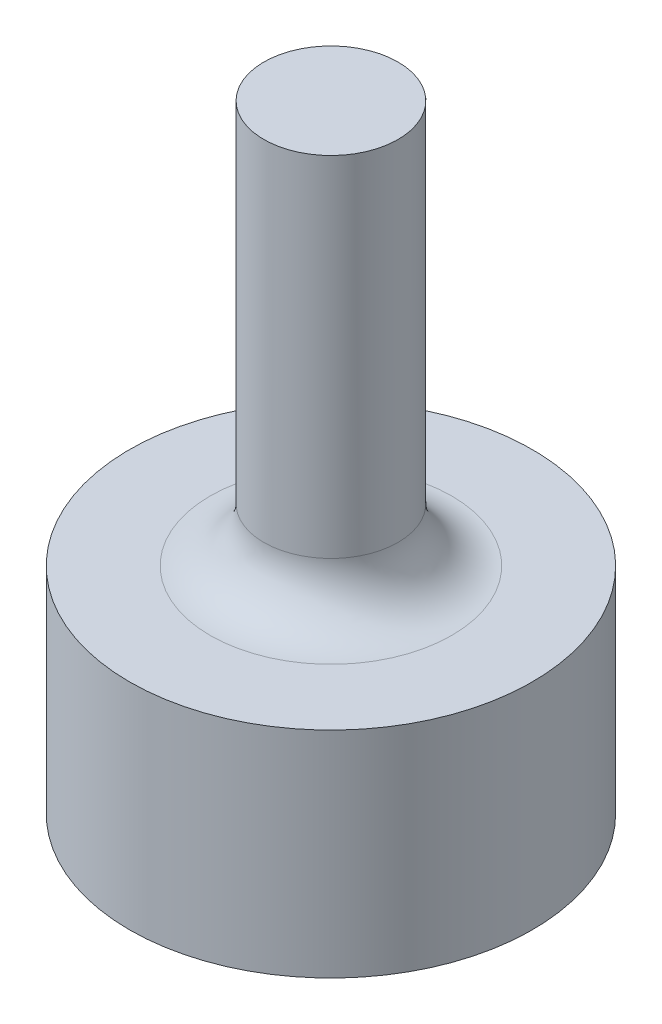
ISO-10303-21;
HEADER;
FILE_DESCRIPTION(('STEP AP214'),'2;1');
FILE_NAME('part.step','',(''),(''),'','','');
FILE_SCHEMA(('AUTOMOTIVE_DESIGN { 1 0 10303 214 1 1 1 1 }'));
ENDSEC;
DATA;
#1=APPLICATION_CONTEXT('core data for automotive mechanical design processes');
#2=APPLICATION_PROTOCOL_DEFINITION('international standard','automotive_design',2000,#1);
#3=PRODUCT_CONTEXT('',#1,'mechanical');
#4=PRODUCT('Part','Part','',(#3));
#5=PRODUCT_RELATED_PRODUCT_CATEGORY('part','',(#4));
#6=PRODUCT_DEFINITION_FORMATION('','',#4);
#7=PRODUCT_DEFINITION_CONTEXT('part definition',#1,'design');
#8=PRODUCT_DEFINITION('design','',#6,#7);
#9=PRODUCT_DEFINITION_SHAPE('','',#8);
#10=(LENGTH_UNIT() NAMED_UNIT(*) SI_UNIT(.MILLI.,.METRE.));
#11=(NAMED_UNIT(*) PLANE_ANGLE_UNIT() SI_UNIT($,.RADIAN.));
#12=(NAMED_UNIT(*) SI_UNIT($,.STERADIAN.) SOLID_ANGLE_UNIT());
#13=UNCERTAINTY_MEASURE_WITH_UNIT(LENGTH_MEASURE(1.E-05),#10,'distance_accuracy_value','');
#14=(GEOMETRIC_REPRESENTATION_CONTEXT(3) GLOBAL_UNCERTAINTY_ASSIGNED_CONTEXT((#13)) GLOBAL_UNIT_ASSIGNED_CONTEXT((#10,
#11,#12)) REPRESENTATION_CONTEXT('',''));
#15=CARTESIAN_POINT('',(0.,0.,0.));
#16=DIRECTION('',(0.,0.,1.));
#17=DIRECTION('',(1.,0.,0.));
#18=AXIS2_PLACEMENT_3D('',#15,#16,#17);
#19=CARTESIAN_POINT('',(0.,10.16,0.));
#20=DIRECTION('',(0.,-1.,0.));
#21=DIRECTION('',(0.,0.,-1.));
#22=AXIS2_PLACEMENT_3D('',#19,#20,#21);
#23=CYLINDRICAL_SURFACE('',#22,9.525);
#24=CARTESIAN_POINT('',(0.,10.16,0.));
#25=DIRECTION('',(0.,1.,0.));
#26=DIRECTION('',(0.,0.,1.));
#27=AXIS2_PLACEMENT_3D('',#24,#25,#26);
#28=CIRCLE('',#27,9.525);
#29=CARTESIAN_POINT('',(0.,10.16,9.525));
#30=VERTEX_POINT('',#29);
#31=EDGE_CURVE('E50',#30,#30,#28,.T.);
#32=ORIENTED_EDGE('',*,*,#31,.F.);
#33=EDGE_LOOP('',(#32));
#34=FACE_BOUND('',#33,.T.);
#35=CARTESIAN_POINT('',(0.,0.,0.));
#36=DIRECTION('',(0.,1.,0.));
#37=DIRECTION('',(0.,0.,1.));
#38=AXIS2_PLACEMENT_3D('',#35,#36,#37);
#39=CIRCLE('',#38,9.525);
#40=CARTESIAN_POINT('',(0.,0.,9.525));
#41=VERTEX_POINT('',#40);
#42=EDGE_CURVE('E55',#41,#41,#39,.T.);
#43=ORIENTED_EDGE('',*,*,#42,.T.);
#44=EDGE_LOOP('',(#43));
#45=FACE_BOUND('',#44,.T.);
#46=ADVANCED_FACE('F37',(#34,#45),#23,.T.);
#47=CARTESIAN_POINT('',(0.,10.16,0.));
#48=DIRECTION('',(0.,1.,0.));
#49=DIRECTION('',(0.,0.,1.));
#50=AXIS2_PLACEMENT_3D('',#47,#48,#49);
#51=PLANE('',#50);
#52=CARTESIAN_POINT('',(0.,10.16,0.));
#53=DIRECTION('',(0.,1.,0.));
#54=DIRECTION('',(0.,0.,1.));
#55=AXIS2_PLACEMENT_3D('',#52,#53,#54);
#56=CIRCLE('',#55,5.715);
#57=CARTESIAN_POINT('',(0.,10.16,5.715));
#58=VERTEX_POINT('',#57);
#59=EDGE_CURVE('E10',#58,#58,#56,.F.);
#60=ORIENTED_EDGE('',*,*,#59,.T.);
#61=EDGE_LOOP('',(#60));
#62=FACE_BOUND('',#61,.T.);
#63=ORIENTED_EDGE('',*,*,#31,.T.);
#64=EDGE_LOOP('',(#63));
#65=FACE_BOUND('',#64,.T.);
#66=ADVANCED_FACE('F89',(#62,#65),#51,.T.);
#67=CARTESIAN_POINT('',(0.,0.,0.));
#68=DIRECTION('',(0.,1.,0.));
#69=DIRECTION('',(0.,0.,1.));
#70=AXIS2_PLACEMENT_3D('',#67,#68,#69);
#71=PLANE('',#70);
#72=CARTESIAN_POINT('',(0.,0.,0.));
#73=DIRECTION('',(0.,-1.,0.));
#74=DIRECTION('',(0.,0.,-1.));
#75=AXIS2_PLACEMENT_3D('',#72,#73,#74);
#76=CIRCLE('',#75,7.9375);
#77=CARTESIAN_POINT('',(0.,0.,-7.9375));
#78=VERTEX_POINT('',#77);
#79=EDGE_CURVE('E62',#78,#78,#76,.T.);
#80=ORIENTED_EDGE('',*,*,#79,.F.);
#81=EDGE_LOOP('',(#80));
#82=FACE_BOUND('',#81,.T.);
#83=ORIENTED_EDGE('',*,*,#42,.F.);
#84=EDGE_LOOP('',(#83));
#85=FACE_BOUND('',#84,.T.);
#86=ADVANCED_FACE('F94',(#82,#85),#71,.F.);
#87=CARTESIAN_POINT('',(0.,3.175,0.));
#88=DIRECTION('',(0.,-1.,0.));
#89=DIRECTION('',(0.,0.,-1.));
#90=AXIS2_PLACEMENT_3D('',#87,#88,#89);
#91=CYLINDRICAL_SURFACE('',#90,7.9375);
#92=CARTESIAN_POINT('',(0.,3.175,0.));
#93=DIRECTION('',(0.,-1.,0.));
#94=DIRECTION('',(0.,0.,-1.));
#95=AXIS2_PLACEMENT_3D('',#92,#93,#94);
#96=CIRCLE('',#95,7.9375);
#97=CARTESIAN_POINT('',(0.,3.175,-7.9375));
#98=VERTEX_POINT('',#97);
#99=EDGE_CURVE('E60',#98,#98,#96,.T.);
#100=ORIENTED_EDGE('',*,*,#99,.F.);
#101=EDGE_LOOP('',(#100));
#102=FACE_BOUND('',#101,.T.);
#103=ORIENTED_EDGE('',*,*,#79,.T.);
#104=EDGE_LOOP('',(#103));
#105=FACE_BOUND('',#104,.T.);
#106=ADVANCED_FACE('F85',(#102,#105),#91,.F.);
#107=CARTESIAN_POINT('',(0.,3.175,0.));
#108=DIRECTION('',(0.,-1.,0.));
#109=DIRECTION('',(0.,0.,-1.));
#110=AXIS2_PLACEMENT_3D('',#107,#108,#109);
#111=PLANE('',#110);
#112=ORIENTED_EDGE('',*,*,#99,.T.);
#113=EDGE_LOOP('',(#112));
#114=FACE_BOUND('',#113,.T.);
#115=ADVANCED_FACE('F78',(#114),#111,.T.);
#116=CARTESIAN_POINT('',(0.,29.21,0.));
#117=DIRECTION('',(0.,-1.,0.));
#118=DIRECTION('',(0.,0.,-1.));
#119=AXIS2_PLACEMENT_3D('',#116,#117,#118);
#120=CYLINDRICAL_SURFACE('',#119,3.175);
#121=CARTESIAN_POINT('',(0.,12.7,0.));
#122=DIRECTION('',(0.,1.,0.));
#123=DIRECTION('',(0.,0.,1.));
#124=AXIS2_PLACEMENT_3D('',#121,#122,#123);
#125=CIRCLE('',#124,3.175);
#126=CARTESIAN_POINT('',(0.,12.7,-3.175));
#127=VERTEX_POINT('',#126);
#128=EDGE_CURVE('E45',#127,#127,#125,.T.);
#129=CARTESIAN_POINT('',(0.,29.21,0.));
#130=DIRECTION('',(0.,1.,0.));
#131=DIRECTION('',(0.,0.,1.));
#132=AXIS2_PLACEMENT_3D('',#129,#130,#131);
#133=CIRCLE('',#132,3.175);
#134=CARTESIAN_POINT('',(0.,29.21,-3.175));
#135=VERTEX_POINT('',#134);
#136=EDGE_CURVE('E66',#135,#135,#133,.T.);
#137=CARTESIAN_POINT('',(0.,12.7,-3.175));
#138=CARTESIAN_POINT('',(0.,12.8719791666667,-3.175));
#139=CARTESIAN_POINT('',(0.,13.0439583333333,-3.175));
#140=CARTESIAN_POINT('',(0.,13.3879166666667,-3.175));
#141=CARTESIAN_POINT('',(0.,13.5598958333333,-3.175));
#142=CARTESIAN_POINT('',(0.,13.9038541666667,-3.175));
#143=CARTESIAN_POINT('',(0.,14.0758333333333,-3.175));
#144=CARTESIAN_POINT('',(0.,14.4197916666667,-3.175));
#145=CARTESIAN_POINT('',(0.,14.5917708333333,-3.175));
#146=CARTESIAN_POINT('',(0.,14.9357291666667,-3.175));
#147=CARTESIAN_POINT('',(0.,15.1077083333333,-3.175));
#148=CARTESIAN_POINT('',(0.,15.4516666666667,-3.175));
#149=CARTESIAN_POINT('',(0.,15.6236458333333,-3.175));
#150=CARTESIAN_POINT('',(0.,15.9676041666667,-3.175));
#151=CARTESIAN_POINT('',(0.,16.1395833333333,-3.175));
#152=CARTESIAN_POINT('',(0.,16.4835416666667,-3.175));
#153=CARTESIAN_POINT('',(0.,16.6555208333333,-3.175));
#154=CARTESIAN_POINT('',(0.,16.9994791666667,-3.175));
#155=CARTESIAN_POINT('',(0.,17.1714583333333,-3.175));
#156=CARTESIAN_POINT('',(0.,17.5154166666667,-3.175));
#157=CARTESIAN_POINT('',(0.,17.6873958333333,-3.175));
#158=CARTESIAN_POINT('',(0.,18.0313541666667,-3.175));
#159=CARTESIAN_POINT('',(0.,18.2033333333333,-3.175));
#160=CARTESIAN_POINT('',(0.,18.5472916666667,-3.175));
#161=CARTESIAN_POINT('',(0.,18.7192708333333,-3.175));
#162=CARTESIAN_POINT('',(0.,19.0632291666667,-3.175));
#163=CARTESIAN_POINT('',(0.,19.2352083333333,-3.175));
#164=CARTESIAN_POINT('',(0.,19.5791666666667,-3.175));
#165=CARTESIAN_POINT('',(0.,19.7511458333333,-3.175));
#166=CARTESIAN_POINT('',(0.,20.0951041666667,-3.175));
#167=CARTESIAN_POINT('',(0.,20.2670833333333,-3.175));
#168=CARTESIAN_POINT('',(0.,20.6110416666667,-3.175));
#169=CARTESIAN_POINT('',(0.,20.7830208333333,-3.175));
#170=CARTESIAN_POINT('',(0.,21.1269791666667,-3.175));
#171=CARTESIAN_POINT('',(0.,21.2989583333333,-3.175));
#172=CARTESIAN_POINT('',(0.,21.6429166666667,-3.175));
#173=CARTESIAN_POINT('',(0.,21.8148958333333,-3.175));
#174=CARTESIAN_POINT('',(0.,22.1588541666667,-3.175));
#175=CARTESIAN_POINT('',(0.,22.3308333333333,-3.175));
#176=CARTESIAN_POINT('',(0.,22.6747916666667,-3.175));
#177=CARTESIAN_POINT('',(0.,22.8467708333333,-3.175));
#178=CARTESIAN_POINT('',(0.,23.1907291666667,-3.175));
#179=CARTESIAN_POINT('',(0.,23.3627083333333,-3.175));
#180=CARTESIAN_POINT('',(0.,23.7066666666667,-3.175));
#181=CARTESIAN_POINT('',(0.,23.8786458333333,-3.175));
#182=CARTESIAN_POINT('',(0.,24.2226041666667,-3.175));
#183=CARTESIAN_POINT('',(0.,24.3945833333333,-3.175));
#184=CARTESIAN_POINT('',(0.,24.7385416666667,-3.175));
#185=CARTESIAN_POINT('',(0.,24.9105208333333,-3.175));
#186=CARTESIAN_POINT('',(0.,25.2544791666667,-3.175));
#187=CARTESIAN_POINT('',(0.,25.4264583333333,-3.175));
#188=CARTESIAN_POINT('',(0.,25.7704166666667,-3.175));
#189=CARTESIAN_POINT('',(0.,25.9423958333333,-3.175));
#190=CARTESIAN_POINT('',(0.,26.2863541666667,-3.175));
#191=CARTESIAN_POINT('',(0.,26.4583333333333,-3.175));
#192=CARTESIAN_POINT('',(0.,26.8022916666667,-3.175));
#193=CARTESIAN_POINT('',(0.,26.9742708333333,-3.175));
#194=CARTESIAN_POINT('',(0.,27.3182291666667,-3.175));
#195=CARTESIAN_POINT('',(0.,27.4902083333333,-3.175));
#196=CARTESIAN_POINT('',(0.,27.8341666666667,-3.175));
#197=CARTESIAN_POINT('',(0.,28.0061458333333,-3.175));
#198=CARTESIAN_POINT('',(0.,28.3501041666667,-3.175));
#199=CARTESIAN_POINT('',(0.,28.5220833333333,-3.175));
#200=CARTESIAN_POINT('',(0.,28.8660416666667,-3.175));
#201=CARTESIAN_POINT('',(0.,29.0380208333333,-3.175));
#202=CARTESIAN_POINT('',(0.,29.21,-3.175));
#203=B_SPLINE_CURVE_WITH_KNOTS('',3,(#137,#138,#139,#140,#141,#142,#143,#144,#145,#146,#147,
#148,#149,#150,#151,#152,#153,#154,#155,#156,#157,#158,#159,#160,#161,#162,#163,#164,#165,#166,
#167,#168,#169,#170,#171,#172,#173,#174,#175,#176,#177,#178,#179,#180,#181,#182,#183,#184,#185,
#186,#187,#188,#189,#190,#191,#192,#193,#194,#195,#196,#197,#198,#199,#200,#201,#202),
.UNSPECIFIED.,.F.,.F.,(4,2,2,2,2,2,2,2,2,2,2,2,2,2,2,2,2,2,2,2,2,2,2,2,2,2,2,2,2,2,2,2,4),(0.,
0.515937500000001,1.031875,1.5478125,2.06375,2.5796875,3.095625,3.61156249999999,4.1275,
4.6434375,5.159375,5.6753125,6.19125,6.7071875,7.223125,7.73906249999999,8.255,8.7709375,
9.286875,9.80281249999999,10.31875,10.8346875,11.350625,11.8665625,12.3825,12.8984375,13.414375,
13.9303125,14.44625,14.9621875,15.478125,15.9940625,16.51),.UNSPECIFIED.);
#204=EDGE_CURVE('BSEAM76',#127,#135,#203,.T.);
#205=ORIENTED_EDGE('',*,*,#128,.T.);
#206=ORIENTED_EDGE('',*,*,#136,.F.);
#207=ORIENTED_EDGE('',*,*,#204,.T.);
#208=ORIENTED_EDGE('',*,*,#204,.F.);
#209=EDGE_LOOP('',(#205,#207,#206,#208));
#210=FACE_BOUND('',#209,.T.);
#211=ADVANCED_FACE('F76',(#210),#120,.T.);
#212=CARTESIAN_POINT('',(0.,29.21,0.));
#213=DIRECTION('',(0.,1.,0.));
#214=DIRECTION('',(0.,0.,1.));
#215=AXIS2_PLACEMENT_3D('',#212,#213,#214);
#216=PLANE('',#215);
#217=ORIENTED_EDGE('',*,*,#136,.T.);
#218=EDGE_LOOP('',(#217));
#219=FACE_BOUND('',#218,.T.);
#220=ADVANCED_FACE('F74',(#219),#216,.T.);
#221=CARTESIAN_POINT('',(0.,12.7,0.));
#222=DIRECTION('',(0.,1.,0.));
#223=DIRECTION('',(0.,0.,1.));
#224=AXIS2_PLACEMENT_3D('',#221,#222,#223);
#225=TOROIDAL_SURFACE('',#224,5.715,2.54);
#226=ORIENTED_EDGE('',*,*,#59,.F.);
#227=EDGE_LOOP('',(#226));
#228=FACE_BOUND('',#227,.T.);
#229=ORIENTED_EDGE('',*,*,#128,.F.);
#230=EDGE_LOOP('',(#229));
#231=FACE_BOUND('',#230,.T.);
#232=ADVANCED_FACE('F39',(#228,#231),#225,.F.);
#233=CLOSED_SHELL('',(#46,#66,#86,#106,#115,#211,#220,#232));
#234=MANIFOLD_SOLID_BREP('B2',#233);
#235=ADVANCED_BREP_SHAPE_REPRESENTATION('',(#18,#234),#14);
#236=SHAPE_DEFINITION_REPRESENTATION(#9,#235);
ENDSEC;
END-ISO-10303-21;
